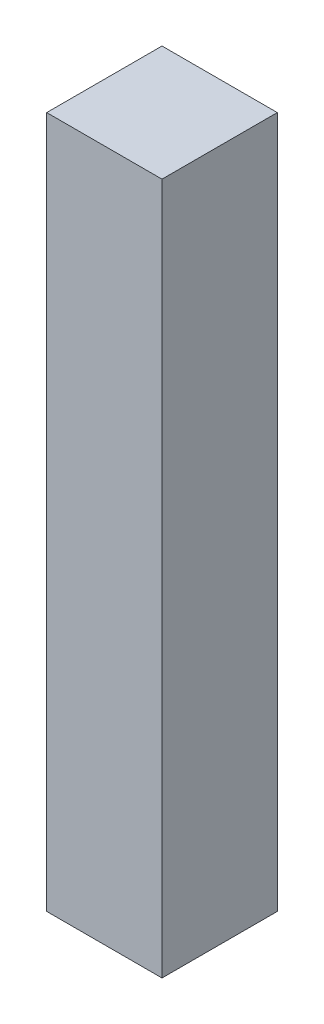
ISO-10303-21;
HEADER;
FILE_DESCRIPTION(('STEP AP214'),'2;1');
FILE_NAME('part.step','',(''),(''),'','','');
FILE_SCHEMA(('AUTOMOTIVE_DESIGN { 1 0 10303 214 1 1 1 1 }'));
ENDSEC;
DATA;
#1=APPLICATION_CONTEXT('core data for automotive mechanical design processes');
#2=APPLICATION_PROTOCOL_DEFINITION('international standard','automotive_design',2000,#1);
#3=PRODUCT_CONTEXT('',#1,'mechanical');
#4=PRODUCT('Part','Part','',(#3));
#5=PRODUCT_RELATED_PRODUCT_CATEGORY('part','',(#4));
#6=PRODUCT_DEFINITION_FORMATION('','',#4);
#7=PRODUCT_DEFINITION_CONTEXT('part definition',#1,'design');
#8=PRODUCT_DEFINITION('design','',#6,#7);
#9=PRODUCT_DEFINITION_SHAPE('','',#8);
#10=(LENGTH_UNIT() NAMED_UNIT(*) SI_UNIT(.MILLI.,.METRE.));
#11=(NAMED_UNIT(*) PLANE_ANGLE_UNIT() SI_UNIT($,.RADIAN.));
#12=(NAMED_UNIT(*) SI_UNIT($,.STERADIAN.) SOLID_ANGLE_UNIT());
#13=UNCERTAINTY_MEASURE_WITH_UNIT(LENGTH_MEASURE(1.E-05),#10,'distance_accuracy_value','');
#14=(GEOMETRIC_REPRESENTATION_CONTEXT(3) GLOBAL_UNCERTAINTY_ASSIGNED_CONTEXT((#13)) GLOBAL_UNIT_ASSIGNED_CONTEXT((#10,
#11,#12)) REPRESENTATION_CONTEXT('',''));
#15=CARTESIAN_POINT('',(0.,0.,0.));
#16=DIRECTION('',(0.,0.,1.));
#17=DIRECTION('',(1.,0.,0.));
#18=AXIS2_PLACEMENT_3D('',#15,#16,#17);
#19=CARTESIAN_POINT('',(-2.50000000000014,15.,2.5));
#20=DIRECTION('',(1.00000000000001,0.,0.));
#21=DIRECTION('',(0.,0.,-1.00000000000001));
#22=AXIS2_PLACEMENT_3D('',#19,#20,#21);
#23=PLANE('',#22);
#24=DIRECTION('',(0.,0.,1.00000000000001));
#25=VECTOR('',#24,1.);
#26=CARTESIAN_POINT('',(-2.5,-15.,2.5));
#27=LINE('',#26,#25);
#28=CARTESIAN_POINT('',(-2.5,-15.,-2.5));
#29=VERTEX_POINT('',#28);
#30=CARTESIAN_POINT('',(-2.5,-15.,2.5));
#31=VERTEX_POINT('',#30);
#32=EDGE_CURVE('E112',#29,#31,#27,.T.);
#33=ORIENTED_EDGE('',*,*,#32,.T.);
#34=DIRECTION('',(0.,-1.,0.));
#35=VECTOR('',#34,1.);
#36=CARTESIAN_POINT('',(-2.50000000000014,15.,2.5));
#37=LINE('',#36,#35);
#38=CARTESIAN_POINT('',(-2.50000000000014,15.,2.5));
#39=VERTEX_POINT('',#38);
#40=EDGE_CURVE('E11',#39,#31,#37,.T.);
#41=ORIENTED_EDGE('',*,*,#40,.F.);
#42=DIRECTION('',(0.,0.,1.00000000000001));
#43=VECTOR('',#42,1.);
#44=CARTESIAN_POINT('',(-2.50000000000014,15.,2.5));
#45=LINE('',#44,#43);
#46=CARTESIAN_POINT('',(-2.50000000000031,15.,-2.5));
#47=VERTEX_POINT('',#46);
#48=EDGE_CURVE('E96',#47,#39,#45,.T.);
#49=ORIENTED_EDGE('',*,*,#48,.F.);
#50=DIRECTION('',(0.,-1.,0.));
#51=VECTOR('',#50,1.);
#52=CARTESIAN_POINT('',(-2.50000000000031,15.,-2.5));
#53=LINE('',#52,#51);
#54=EDGE_CURVE('E108',#47,#29,#53,.T.);
#55=ORIENTED_EDGE('',*,*,#54,.T.);
#56=EDGE_LOOP('',(#33,#41,#49,#55));
#57=FACE_BOUND('',#56,.T.);
#58=ADVANCED_FACE('F44',(#57),#23,.F.);
#59=CARTESIAN_POINT('',(2.49999999999995,15.,2.49999999999999));
#60=DIRECTION('',(0.,0.,-1.00000000000001));
#61=DIRECTION('',(-1.00000000000001,0.,0.));
#62=AXIS2_PLACEMENT_3D('',#59,#60,#61);
#63=PLANE('',#62);
#64=DIRECTION('',(1.00000000000001,0.,0.));
#65=VECTOR('',#64,1.);
#66=CARTESIAN_POINT('',(2.5,-15.,2.5));
#67=LINE('',#66,#65);
#68=CARTESIAN_POINT('',(2.5,-15.,2.5));
#69=VERTEX_POINT('',#68);
#70=EDGE_CURVE('E101',#31,#69,#67,.T.);
#71=ORIENTED_EDGE('',*,*,#70,.T.);
#72=DIRECTION('',(0.,-1.,0.));
#73=VECTOR('',#72,1.);
#74=CARTESIAN_POINT('',(2.49999999999995,15.,2.49999999999999));
#75=LINE('',#74,#73);
#76=CARTESIAN_POINT('',(2.49999999999995,15.,2.49999999999999));
#77=VERTEX_POINT('',#76);
#78=EDGE_CURVE('E53',#77,#69,#75,.T.);
#79=ORIENTED_EDGE('',*,*,#78,.F.);
#80=DIRECTION('',(1.00000000000001,0.,0.));
#81=VECTOR('',#80,1.);
#82=CARTESIAN_POINT('',(2.49999999999995,15.,2.49999999999999));
#83=LINE('',#82,#81);
#84=EDGE_CURVE('E91',#39,#77,#83,.T.);
#85=ORIENTED_EDGE('',*,*,#84,.F.);
#86=ORIENTED_EDGE('',*,*,#40,.T.);
#87=EDGE_LOOP('',(#71,#79,#85,#86));
#88=FACE_BOUND('',#87,.T.);
#89=ADVANCED_FACE('F100',(#88),#63,.F.);
#90=CARTESIAN_POINT('',(2.49999999999995,15.,2.49999999999999));
#91=DIRECTION('',(-1.00000000000001,0.,0.));
#92=DIRECTION('',(0.,0.,1.00000000000001));
#93=AXIS2_PLACEMENT_3D('',#90,#91,#92);
#94=PLANE('',#93);
#95=DIRECTION('',(0.,0.,-1.00000000000001));
#96=VECTOR('',#95,1.);
#97=CARTESIAN_POINT('',(2.5,-15.,2.5));
#98=LINE('',#97,#96);
#99=CARTESIAN_POINT('',(2.5,-15.,-2.5));
#100=VERTEX_POINT('',#99);
#101=EDGE_CURVE('E78',#69,#100,#98,.T.);
#102=ORIENTED_EDGE('',*,*,#101,.T.);
#103=DIRECTION('',(0.,-1.,0.));
#104=VECTOR('',#103,1.);
#105=CARTESIAN_POINT('',(2.49999999999961,15.,-2.49999999999997));
#106=LINE('',#105,#104);
#107=CARTESIAN_POINT('',(2.49999999999961,15.,-2.49999999999997));
#108=VERTEX_POINT('',#107);
#109=EDGE_CURVE('E103',#108,#100,#106,.T.);
#110=ORIENTED_EDGE('',*,*,#109,.F.);
#111=DIRECTION('',(0.,0.,-1.00000000000001));
#112=VECTOR('',#111,1.);
#113=CARTESIAN_POINT('',(2.49999999999995,15.,2.49999999999999));
#114=LINE('',#113,#112);
#115=EDGE_CURVE('E94',#77,#108,#114,.T.);
#116=ORIENTED_EDGE('',*,*,#115,.F.);
#117=ORIENTED_EDGE('',*,*,#78,.T.);
#118=EDGE_LOOP('',(#102,#110,#116,#117));
#119=FACE_BOUND('',#118,.T.);
#120=ADVANCED_FACE('F104',(#119),#94,.F.);
#121=CARTESIAN_POINT('',(2.49999999999961,15.,-2.49999999999997));
#122=DIRECTION('',(0.,0.,1.00000000000001));
#123=DIRECTION('',(1.00000000000001,0.,0.));
#124=AXIS2_PLACEMENT_3D('',#121,#122,#123);
#125=PLANE('',#124);
#126=DIRECTION('',(-1.00000000000001,0.,0.));
#127=VECTOR('',#126,1.);
#128=CARTESIAN_POINT('',(2.5,-15.,-2.5));
#129=LINE('',#128,#127);
#130=EDGE_CURVE('E84',#100,#29,#129,.T.);
#131=ORIENTED_EDGE('',*,*,#130,.T.);
#132=ORIENTED_EDGE('',*,*,#54,.F.);
#133=DIRECTION('',(-1.00000000000001,0.,0.));
#134=VECTOR('',#133,1.);
#135=CARTESIAN_POINT('',(2.49999999999961,15.,-2.49999999999997));
#136=LINE('',#135,#134);
#137=EDGE_CURVE('E61',#108,#47,#136,.T.);
#138=ORIENTED_EDGE('',*,*,#137,.F.);
#139=ORIENTED_EDGE('',*,*,#109,.T.);
#140=EDGE_LOOP('',(#131,#132,#138,#139));
#141=FACE_BOUND('',#140,.T.);
#142=ADVANCED_FACE('F125',(#141),#125,.F.);
#143=CARTESIAN_POINT('',(-3.88578058618805E-13,15.,0.));
#144=DIRECTION('',(0.,1.,0.));
#145=DIRECTION('',(0.,0.,1.00000000000001));
#146=AXIS2_PLACEMENT_3D('',#143,#144,#145);
#147=PLANE('',#146);
#148=ORIENTED_EDGE('',*,*,#48,.T.);
#149=ORIENTED_EDGE('',*,*,#84,.T.);
#150=ORIENTED_EDGE('',*,*,#115,.T.);
#151=ORIENTED_EDGE('',*,*,#137,.T.);
#152=EDGE_LOOP('',(#148,#149,#150,#151));
#153=FACE_BOUND('',#152,.T.);
#154=ADVANCED_FACE('F92',(#153),#147,.T.);
#155=CARTESIAN_POINT('',(0.,-15.,0.));
#156=DIRECTION('',(0.,1.,0.));
#157=DIRECTION('',(0.,0.,1.00000000000001));
#158=AXIS2_PLACEMENT_3D('',#155,#156,#157);
#159=PLANE('',#158);
#160=ORIENTED_EDGE('',*,*,#32,.F.);
#161=ORIENTED_EDGE('',*,*,#130,.F.);
#162=ORIENTED_EDGE('',*,*,#101,.F.);
#163=ORIENTED_EDGE('',*,*,#70,.F.);
#164=EDGE_LOOP('',(#160,#161,#162,#163));
#165=FACE_BOUND('',#164,.T.);
#166=ADVANCED_FACE('F128',(#165),#159,.F.);
#167=CLOSED_SHELL('',(#58,#89,#120,#142,#154,#166));
#168=MANIFOLD_SOLID_BREP('B2',#167);
#169=ADVANCED_BREP_SHAPE_REPRESENTATION('',(#18,#168),#14);
#170=SHAPE_DEFINITION_REPRESENTATION(#9,#169);
ENDSEC;
END-ISO-10303-21;
